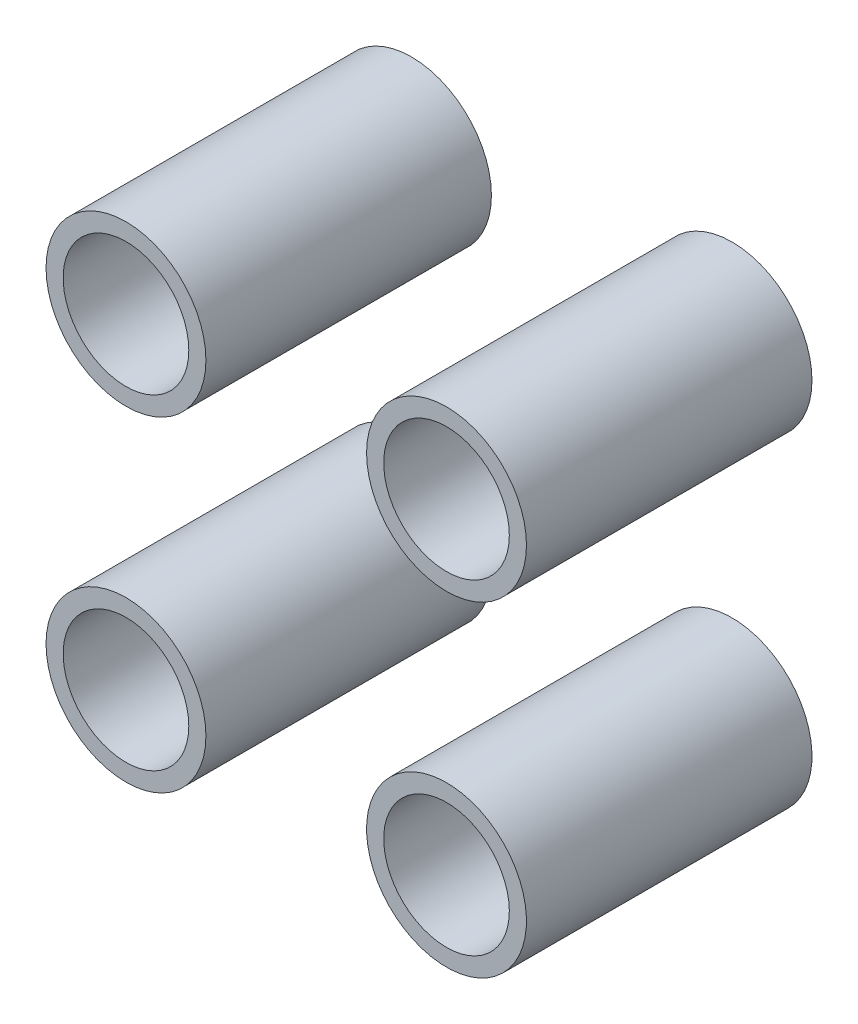
ISO-10303-21;
HEADER;
FILE_DESCRIPTION(('STEP AP214'),'2;1');
FILE_NAME('part.step','',(''),(''),'','','');
FILE_SCHEMA(('AUTOMOTIVE_DESIGN { 1 0 10303 214 1 1 1 1 }'));
ENDSEC;
DATA;
#1=APPLICATION_CONTEXT('core data for automotive mechanical design processes');
#2=APPLICATION_PROTOCOL_DEFINITION('international standard','automotive_design',2000,#1);
#3=PRODUCT_CONTEXT('',#1,'mechanical');
#4=PRODUCT('Part','Part','',(#3));
#5=PRODUCT_RELATED_PRODUCT_CATEGORY('part','',(#4));
#6=PRODUCT_DEFINITION_FORMATION('','',#4);
#7=PRODUCT_DEFINITION_CONTEXT('part definition',#1,'design');
#8=PRODUCT_DEFINITION('design','',#6,#7);
#9=PRODUCT_DEFINITION_SHAPE('','',#8);
#10=(LENGTH_UNIT() NAMED_UNIT(*) SI_UNIT(.MILLI.,.METRE.));
#11=(NAMED_UNIT(*) PLANE_ANGLE_UNIT() SI_UNIT($,.RADIAN.));
#12=(NAMED_UNIT(*) SI_UNIT($,.STERADIAN.) SOLID_ANGLE_UNIT());
#13=UNCERTAINTY_MEASURE_WITH_UNIT(LENGTH_MEASURE(1.E-05),#10,'distance_accuracy_value','');
#14=(GEOMETRIC_REPRESENTATION_CONTEXT(3) GLOBAL_UNCERTAINTY_ASSIGNED_CONTEXT((#13)) GLOBAL_UNIT_ASSIGNED_CONTEXT((#10,
#11,#12)) REPRESENTATION_CONTEXT('',''));
#15=CARTESIAN_POINT('',(0.,0.,0.));
#16=DIRECTION('',(0.,0.,1.));
#17=DIRECTION('',(1.,0.,0.));
#18=AXIS2_PLACEMENT_3D('',#15,#16,#17);
#19=CARTESIAN_POINT('',(28.0668844013724,-28.5,11.5303963476413));
#20=DIRECTION('',(0.,0.,1.));
#21=DIRECTION('',(0.40024567660561,-0.916407877726134,0.));
#22=AXIS2_PLACEMENT_3D('',#19,#20,#21);
#23=PLANE('',#22);
#24=CARTESIAN_POINT('',(28.0668844013724,-28.5,11.5303963476413));
#25=DIRECTION('',(0.,0.,1.));
#26=DIRECTION('',(0.40024567660561,-0.916407877726134,0.));
#27=AXIS2_PLACEMENT_3D('',#24,#25,#26);
#28=CIRCLE('',#27,14.);
#29=CARTESIAN_POINT('',(22.4634449288938,-15.6702897118341,11.5303963476413));
#30=VERTEX_POINT('',#29);
#31=EDGE_CURVE('P0_E10',#30,#30,#28,.T.);
#32=ORIENTED_EDGE('',*,*,#31,.T.);
#33=EDGE_LOOP('',(#32));
#34=FACE_BOUND('',#33,.T.);
#35=CARTESIAN_POINT('',(28.0668844013724,-28.5,11.5303963476413));
#36=DIRECTION('',(0.,0.,1.));
#37=DIRECTION('',(0.40024567660561,-0.916407877726134,0.));
#38=AXIS2_PLACEMENT_3D('',#35,#36,#37);
#39=CIRCLE('',#38,11.);
#40=CARTESIAN_POINT('',(23.6641819587107,-18.4195133450125,11.5303963476413));
#41=VERTEX_POINT('',#40);
#42=EDGE_CURVE('P0_E26',#41,#41,#39,.T.);
#43=ORIENTED_EDGE('',*,*,#42,.F.);
#44=EDGE_LOOP('',(#43));
#45=FACE_BOUND('',#44,.T.);
#46=ADVANCED_FACE('P0_F15',(#34,#45),#23,.T.);
#47=CARTESIAN_POINT('',(28.0668844013724,-28.5,-38.4696036523587));
#48=DIRECTION('',(0.,0.,1.));
#49=DIRECTION('',(0.40024567660561,-0.916407877726134,0.));
#50=AXIS2_PLACEMENT_3D('',#47,#48,#49);
#51=PLANE('',#50);
#52=CARTESIAN_POINT('',(28.0668844013724,-28.5,-38.4696036523587));
#53=DIRECTION('',(0.,0.,1.));
#54=DIRECTION('',(0.40024567660561,-0.916407877726134,0.));
#55=AXIS2_PLACEMENT_3D('',#52,#53,#54);
#56=CIRCLE('',#55,14.);
#57=CARTESIAN_POINT('',(22.4634449288938,-15.6702897118341,-38.4696036523587));
#58=VERTEX_POINT('',#57);
#59=EDGE_CURVE('P0_E19',#58,#58,#56,.T.);
#60=ORIENTED_EDGE('',*,*,#59,.F.);
#61=EDGE_LOOP('',(#60));
#62=FACE_BOUND('',#61,.T.);
#63=CARTESIAN_POINT('',(28.0668844013724,-28.5,-38.4696036523587));
#64=DIRECTION('',(0.,0.,1.));
#65=DIRECTION('',(0.40024567660561,-0.916407877726134,0.));
#66=AXIS2_PLACEMENT_3D('',#63,#64,#65);
#67=CIRCLE('',#66,11.);
#68=CARTESIAN_POINT('',(23.6641819587107,-18.4195133450125,-38.4696036523587));
#69=VERTEX_POINT('',#68);
#70=EDGE_CURVE('P0_E28',#69,#69,#67,.T.);
#71=ORIENTED_EDGE('',*,*,#70,.T.);
#72=EDGE_LOOP('',(#71));
#73=FACE_BOUND('',#72,.T.);
#74=ADVANCED_FACE('P0_F38',(#62,#73),#51,.F.);
#75=CARTESIAN_POINT('',(28.0668844013724,-28.5,11.5303963476413));
#76=DIRECTION('',(0.,0.,-1.));
#77=DIRECTION('',(-0.40024567660561,0.916407877726134,0.));
#78=AXIS2_PLACEMENT_3D('',#75,#76,#77);
#79=CYLINDRICAL_SURFACE('',#78,14.);
#80=CARTESIAN_POINT('',(22.4634449288938,-15.6702897118341,11.5303963476413));
#81=CARTESIAN_POINT('',(22.4634449288938,-15.6702897118341,11.0095630143079));
#82=CARTESIAN_POINT('',(22.4634449288938,-15.6702897118341,10.4887296809746));
#83=CARTESIAN_POINT('',(22.4634449288938,-15.6702897118341,9.44706301430792));
#84=CARTESIAN_POINT('',(22.4634449288938,-15.6702897118341,8.92622968097459));
#85=CARTESIAN_POINT('',(22.4634449288938,-15.6702897118341,7.88456301430792));
#86=CARTESIAN_POINT('',(22.4634449288938,-15.6702897118341,7.36372968097459));
#87=CARTESIAN_POINT('',(22.4634449288938,-15.6702897118341,6.32206301430792));
#88=CARTESIAN_POINT('',(22.4634449288938,-15.6702897118341,5.80122968097459));
#89=CARTESIAN_POINT('',(22.4634449288938,-15.6702897118341,4.75956301430792));
#90=CARTESIAN_POINT('',(22.4634449288938,-15.6702897118341,4.23872968097459));
#91=CARTESIAN_POINT('',(22.4634449288938,-15.6702897118341,3.19706301430792));
#92=CARTESIAN_POINT('',(22.4634449288938,-15.6702897118341,2.67622968097459));
#93=CARTESIAN_POINT('',(22.4634449288938,-15.6702897118341,1.63456301430792));
#94=CARTESIAN_POINT('',(22.4634449288938,-15.6702897118341,1.11372968097459));
#95=CARTESIAN_POINT('',(22.4634449288938,-15.6702897118341,0.0720630143079202));
#96=CARTESIAN_POINT('',(22.4634449288938,-15.6702897118341,-0.448770319025413));
#97=CARTESIAN_POINT('',(22.4634449288938,-15.6702897118341,-1.49043698569208));
#98=CARTESIAN_POINT('',(22.4634449288938,-15.6702897118341,-2.01127031902541));
#99=CARTESIAN_POINT('',(22.4634449288938,-15.6702897118341,-3.05293698569208));
#100=CARTESIAN_POINT('',(22.4634449288938,-15.6702897118341,-3.57377031902541));
#101=CARTESIAN_POINT('',(22.4634449288938,-15.6702897118341,-4.61543698569208));
#102=CARTESIAN_POINT('',(22.4634449288938,-15.6702897118341,-5.13627031902541));
#103=CARTESIAN_POINT('',(22.4634449288938,-15.6702897118341,-6.17793698569208));
#104=CARTESIAN_POINT('',(22.4634449288938,-15.6702897118341,-6.69877031902541));
#105=CARTESIAN_POINT('',(22.4634449288938,-15.6702897118341,-7.74043698569208));
#106=CARTESIAN_POINT('',(22.4634449288938,-15.6702897118341,-8.26127031902541));
#107=CARTESIAN_POINT('',(22.4634449288938,-15.6702897118341,-9.30293698569208));
#108=CARTESIAN_POINT('',(22.4634449288938,-15.6702897118341,-9.82377031902541));
#109=CARTESIAN_POINT('',(22.4634449288938,-15.6702897118341,-10.8654369856921));
#110=CARTESIAN_POINT('',(22.4634449288938,-15.6702897118341,-11.3862703190254));
#111=CARTESIAN_POINT('',(22.4634449288938,-15.6702897118341,-12.4279369856921));
#112=CARTESIAN_POINT('',(22.4634449288938,-15.6702897118341,-12.9487703190254));
#113=CARTESIAN_POINT('',(22.4634449288938,-15.6702897118341,-13.9904369856921));
#114=CARTESIAN_POINT('',(22.4634449288938,-15.6702897118341,-14.5112703190254));
#115=CARTESIAN_POINT('',(22.4634449288938,-15.6702897118341,-15.5529369856921));
#116=CARTESIAN_POINT('',(22.4634449288938,-15.6702897118341,-16.0737703190254));
#117=CARTESIAN_POINT('',(22.4634449288938,-15.6702897118341,-17.1154369856921));
#118=CARTESIAN_POINT('',(22.4634449288938,-15.6702897118341,-17.6362703190254));
#119=CARTESIAN_POINT('',(22.4634449288938,-15.6702897118341,-18.6779369856921));
#120=CARTESIAN_POINT('',(22.4634449288938,-15.6702897118341,-19.1987703190254));
#121=CARTESIAN_POINT('',(22.4634449288938,-15.6702897118341,-20.2404369856921));
#122=CARTESIAN_POINT('',(22.4634449288938,-15.6702897118341,-20.7612703190254));
#123=CARTESIAN_POINT('',(22.4634449288938,-15.6702897118341,-21.8029369856921));
#124=CARTESIAN_POINT('',(22.4634449288938,-15.6702897118341,-22.3237703190254));
#125=CARTESIAN_POINT('',(22.4634449288938,-15.6702897118341,-23.3654369856921));
#126=CARTESIAN_POINT('',(22.4634449288938,-15.6702897118341,-23.8862703190254));
#127=CARTESIAN_POINT('',(22.4634449288938,-15.6702897118341,-24.9279369856921));
#128=CARTESIAN_POINT('',(22.4634449288938,-15.6702897118341,-25.4487703190254));
#129=CARTESIAN_POINT('',(22.4634449288938,-15.6702897118341,-26.4904369856921));
#130=CARTESIAN_POINT('',(22.4634449288938,-15.6702897118341,-27.0112703190254));
#131=CARTESIAN_POINT('',(22.4634449288938,-15.6702897118341,-28.0529369856921));
#132=CARTESIAN_POINT('',(22.4634449288938,-15.6702897118341,-28.5737703190254));
#133=CARTESIAN_POINT('',(22.4634449288938,-15.6702897118341,-29.6154369856921));
#134=CARTESIAN_POINT('',(22.4634449288938,-15.6702897118341,-30.1362703190254));
#135=CARTESIAN_POINT('',(22.4634449288938,-15.6702897118341,-31.1779369856921));
#136=CARTESIAN_POINT('',(22.4634449288938,-15.6702897118341,-31.6987703190254));
#137=CARTESIAN_POINT('',(22.4634449288938,-15.6702897118341,-32.7404369856921));
#138=CARTESIAN_POINT('',(22.4634449288938,-15.6702897118341,-33.2612703190254));
#139=CARTESIAN_POINT('',(22.4634449288938,-15.6702897118341,-34.3029369856921));
#140=CARTESIAN_POINT('',(22.4634449288938,-15.6702897118341,-34.8237703190254));
#141=CARTESIAN_POINT('',(22.4634449288938,-15.6702897118341,-35.8654369856921));
#142=CARTESIAN_POINT('',(22.4634449288938,-15.6702897118341,-36.3862703190254));
#143=CARTESIAN_POINT('',(22.4634449288938,-15.6702897118341,-37.4279369856921));
#144=CARTESIAN_POINT('',(22.4634449288938,-15.6702897118341,-37.9487703190254));
#145=CARTESIAN_POINT('',(22.4634449288938,-15.6702897118341,-38.4696036523587));
#146=B_SPLINE_CURVE_WITH_KNOTS('',3,(#80,#81,#82,#83,#84,#85,#86,#87,#88,#89,#90,#91,#92,#93,
#94,#95,#96,#97,#98,#99,#100,#101,#102,#103,#104,#105,#106,#107,#108,#109,#110,#111,#112,#113,
#114,#115,#116,#117,#118,#119,#120,#121,#122,#123,#124,#125,#126,#127,#128,#129,#130,#131,#132,
#133,#134,#135,#136,#137,#138,#139,#140,#141,#142,#143,#144,#145),.UNSPECIFIED.,.F.,.F.,(4,2,2,
2,2,2,2,2,2,2,2,2,2,2,2,2,2,2,2,2,2,2,2,2,2,2,2,2,2,2,2,2,4),(0.,1.5625,3.125,4.6875,6.25,
7.8125,9.375,10.9375,12.5,14.0625,15.625,17.1875,18.75,20.3125,21.875,23.4375,25.,26.5625,
28.125,29.6875,31.25,32.8125,34.375,35.9375,37.5,39.0625,40.625,42.1875,43.75,45.3125,46.875,
48.4375,50.),.UNSPECIFIED.);
#147=EDGE_CURVE('P0_BSEAM17',#30,#58,#146,.T.);
#148=ORIENTED_EDGE('',*,*,#31,.F.);
#149=ORIENTED_EDGE('',*,*,#59,.T.);
#150=ORIENTED_EDGE('',*,*,#147,.T.);
#151=ORIENTED_EDGE('',*,*,#147,.F.);
#152=EDGE_LOOP('',(#148,#150,#149,#151));
#153=FACE_BOUND('',#152,.T.);
#154=ADVANCED_FACE('P0_F17',(#153),#79,.T.);
#155=CARTESIAN_POINT('',(28.0668844013724,-28.5,11.5303963476413));
#156=DIRECTION('',(0.,0.,-1.));
#157=DIRECTION('',(-0.40024567660561,0.916407877726134,0.));
#158=AXIS2_PLACEMENT_3D('',#155,#156,#157);
#159=CYLINDRICAL_SURFACE('',#158,11.);
#160=CARTESIAN_POINT('',(23.6641819587107,-18.4195133450125,11.5303963476413));
#161=CARTESIAN_POINT('',(23.6641819587107,-18.4195133450125,11.0095630143079));
#162=CARTESIAN_POINT('',(23.6641819587107,-18.4195133450125,10.4887296809746));
#163=CARTESIAN_POINT('',(23.6641819587107,-18.4195133450125,9.44706301430792));
#164=CARTESIAN_POINT('',(23.6641819587107,-18.4195133450125,8.92622968097459));
#165=CARTESIAN_POINT('',(23.6641819587107,-18.4195133450125,7.88456301430792));
#166=CARTESIAN_POINT('',(23.6641819587107,-18.4195133450125,7.36372968097459));
#167=CARTESIAN_POINT('',(23.6641819587107,-18.4195133450125,6.32206301430792));
#168=CARTESIAN_POINT('',(23.6641819587107,-18.4195133450125,5.80122968097459));
#169=CARTESIAN_POINT('',(23.6641819587107,-18.4195133450125,4.75956301430792));
#170=CARTESIAN_POINT('',(23.6641819587107,-18.4195133450125,4.23872968097459));
#171=CARTESIAN_POINT('',(23.6641819587107,-18.4195133450125,3.19706301430792));
#172=CARTESIAN_POINT('',(23.6641819587107,-18.4195133450125,2.67622968097459));
#173=CARTESIAN_POINT('',(23.6641819587107,-18.4195133450125,1.63456301430792));
#174=CARTESIAN_POINT('',(23.6641819587107,-18.4195133450125,1.11372968097459));
#175=CARTESIAN_POINT('',(23.6641819587107,-18.4195133450125,0.0720630143079202));
#176=CARTESIAN_POINT('',(23.6641819587107,-18.4195133450125,-0.448770319025413));
#177=CARTESIAN_POINT('',(23.6641819587107,-18.4195133450125,-1.49043698569208));
#178=CARTESIAN_POINT('',(23.6641819587107,-18.4195133450125,-2.01127031902541));
#179=CARTESIAN_POINT('',(23.6641819587107,-18.4195133450125,-3.05293698569208));
#180=CARTESIAN_POINT('',(23.6641819587107,-18.4195133450125,-3.57377031902541));
#181=CARTESIAN_POINT('',(23.6641819587107,-18.4195133450125,-4.61543698569208));
#182=CARTESIAN_POINT('',(23.6641819587107,-18.4195133450125,-5.13627031902541));
#183=CARTESIAN_POINT('',(23.6641819587107,-18.4195133450125,-6.17793698569208));
#184=CARTESIAN_POINT('',(23.6641819587107,-18.4195133450125,-6.69877031902541));
#185=CARTESIAN_POINT('',(23.6641819587107,-18.4195133450125,-7.74043698569208));
#186=CARTESIAN_POINT('',(23.6641819587107,-18.4195133450125,-8.26127031902541));
#187=CARTESIAN_POINT('',(23.6641819587107,-18.4195133450125,-9.30293698569208));
#188=CARTESIAN_POINT('',(23.6641819587107,-18.4195133450125,-9.82377031902541));
#189=CARTESIAN_POINT('',(23.6641819587107,-18.4195133450125,-10.8654369856921));
#190=CARTESIAN_POINT('',(23.6641819587107,-18.4195133450125,-11.3862703190254));
#191=CARTESIAN_POINT('',(23.6641819587107,-18.4195133450125,-12.4279369856921));
#192=CARTESIAN_POINT('',(23.6641819587107,-18.4195133450125,-12.9487703190254));
#193=CARTESIAN_POINT('',(23.6641819587107,-18.4195133450125,-13.9904369856921));
#194=CARTESIAN_POINT('',(23.6641819587107,-18.4195133450125,-14.5112703190254));
#195=CARTESIAN_POINT('',(23.6641819587107,-18.4195133450125,-15.5529369856921));
#196=CARTESIAN_POINT('',(23.6641819587107,-18.4195133450125,-16.0737703190254));
#197=CARTESIAN_POINT('',(23.6641819587107,-18.4195133450125,-17.1154369856921));
#198=CARTESIAN_POINT('',(23.6641819587107,-18.4195133450125,-17.6362703190254));
#199=CARTESIAN_POINT('',(23.6641819587107,-18.4195133450125,-18.6779369856921));
#200=CARTESIAN_POINT('',(23.6641819587107,-18.4195133450125,-19.1987703190254));
#201=CARTESIAN_POINT('',(23.6641819587107,-18.4195133450125,-20.2404369856921));
#202=CARTESIAN_POINT('',(23.6641819587107,-18.4195133450125,-20.7612703190254));
#203=CARTESIAN_POINT('',(23.6641819587107,-18.4195133450125,-21.8029369856921));
#204=CARTESIAN_POINT('',(23.6641819587107,-18.4195133450125,-22.3237703190254));
#205=CARTESIAN_POINT('',(23.6641819587107,-18.4195133450125,-23.3654369856921));
#206=CARTESIAN_POINT('',(23.6641819587107,-18.4195133450125,-23.8862703190254));
#207=CARTESIAN_POINT('',(23.6641819587107,-18.4195133450125,-24.9279369856921));
#208=CARTESIAN_POINT('',(23.6641819587107,-18.4195133450125,-25.4487703190254));
#209=CARTESIAN_POINT('',(23.6641819587107,-18.4195133450125,-26.4904369856921));
#210=CARTESIAN_POINT('',(23.6641819587107,-18.4195133450125,-27.0112703190254));
#211=CARTESIAN_POINT('',(23.6641819587107,-18.4195133450125,-28.0529369856921));
#212=CARTESIAN_POINT('',(23.6641819587107,-18.4195133450125,-28.5737703190254));
#213=CARTESIAN_POINT('',(23.6641819587107,-18.4195133450125,-29.6154369856921));
#214=CARTESIAN_POINT('',(23.6641819587107,-18.4195133450125,-30.1362703190254));
#215=CARTESIAN_POINT('',(23.6641819587107,-18.4195133450125,-31.1779369856921));
#216=CARTESIAN_POINT('',(23.6641819587107,-18.4195133450125,-31.6987703190254));
#217=CARTESIAN_POINT('',(23.6641819587107,-18.4195133450125,-32.7404369856921));
#218=CARTESIAN_POINT('',(23.6641819587107,-18.4195133450125,-33.2612703190254));
#219=CARTESIAN_POINT('',(23.6641819587107,-18.4195133450125,-34.3029369856921));
#220=CARTESIAN_POINT('',(23.6641819587107,-18.4195133450125,-34.8237703190254));
#221=CARTESIAN_POINT('',(23.6641819587107,-18.4195133450125,-35.8654369856921));
#222=CARTESIAN_POINT('',(23.6641819587107,-18.4195133450125,-36.3862703190254));
#223=CARTESIAN_POINT('',(23.6641819587107,-18.4195133450125,-37.4279369856921));
#224=CARTESIAN_POINT('',(23.6641819587107,-18.4195133450125,-37.9487703190254));
#225=CARTESIAN_POINT('',(23.6641819587107,-18.4195133450125,-38.4696036523587));
#226=B_SPLINE_CURVE_WITH_KNOTS('',3,(#160,#161,#162,#163,#164,#165,#166,#167,#168,#169,#170,
#171,#172,#173,#174,#175,#176,#177,#178,#179,#180,#181,#182,#183,#184,#185,#186,#187,#188,#189,
#190,#191,#192,#193,#194,#195,#196,#197,#198,#199,#200,#201,#202,#203,#204,#205,#206,#207,#208,
#209,#210,#211,#212,#213,#214,#215,#216,#217,#218,#219,#220,#221,#222,#223,#224,#225),
.UNSPECIFIED.,.F.,.F.,(4,2,2,2,2,2,2,2,2,2,2,2,2,2,2,2,2,2,2,2,2,2,2,2,2,2,2,2,2,2,2,2,4),(0.,
1.5625,3.125,4.6875,6.25,7.8125,9.375,10.9375,12.5,14.0625,15.625,17.1875,18.75,20.3125,21.875,
23.4375,25.,26.5625,28.125,29.6875,31.25,32.8125,34.375,35.9375,37.5,39.0625,40.625,42.1875,
43.75,45.3125,46.875,48.4375,50.),.UNSPECIFIED.);
#227=EDGE_CURVE('P0_BSEAM34',#41,#69,#226,.T.);
#228=ORIENTED_EDGE('',*,*,#42,.T.);
#229=ORIENTED_EDGE('',*,*,#70,.F.);
#230=ORIENTED_EDGE('',*,*,#227,.T.);
#231=ORIENTED_EDGE('',*,*,#227,.F.);
#232=EDGE_LOOP('',(#228,#230,#229,#231));
#233=FACE_BOUND('',#232,.T.);
#234=ADVANCED_FACE('P0_F34',(#233),#159,.F.);
#235=CLOSED_SHELL('',(#46,#74,#154,#234));
#236=MANIFOLD_SOLID_BREP('P0_B1',#235);
#237=CARTESIAN_POINT('',(-28.0668844013724,-28.5,11.5303963476413));
#238=DIRECTION('',(0.,0.,1.));
#239=DIRECTION('',(1.,0.,0.));
#240=AXIS2_PLACEMENT_3D('',#237,#238,#239);
#241=PLANE('',#240);
#242=CARTESIAN_POINT('',(-28.0668844013724,-28.5,11.5303963476413));
#243=DIRECTION('',(0.,0.,1.));
#244=DIRECTION('',(1.,0.,0.));
#245=AXIS2_PLACEMENT_3D('',#242,#243,#244);
#246=CIRCLE('',#245,14.);
#247=CARTESIAN_POINT('',(-14.0668844013724,-28.5,11.5303963476413));
#248=VERTEX_POINT('',#247);
#249=EDGE_CURVE('P1_E9',#248,#248,#246,.T.);
#250=ORIENTED_EDGE('',*,*,#249,.T.);
#251=EDGE_LOOP('',(#250));
#252=FACE_BOUND('',#251,.T.);
#253=CARTESIAN_POINT('',(-28.0668844013724,-28.5,11.5303963476413));
#254=DIRECTION('',(0.,0.,1.));
#255=DIRECTION('',(1.,0.,0.));
#256=AXIS2_PLACEMENT_3D('',#253,#254,#255);
#257=CIRCLE('',#256,11.);
#258=CARTESIAN_POINT('',(-17.0668844013724,-28.5,11.5303963476413));
#259=VERTEX_POINT('',#258);
#260=EDGE_CURVE('P1_E25',#259,#259,#257,.T.);
#261=ORIENTED_EDGE('',*,*,#260,.F.);
#262=EDGE_LOOP('',(#261));
#263=FACE_BOUND('',#262,.T.);
#264=ADVANCED_FACE('P1_F14',(#252,#263),#241,.T.);
#265=CARTESIAN_POINT('',(-28.0668844013724,-28.5,-38.4696036523587));
#266=DIRECTION('',(0.,0.,1.));
#267=DIRECTION('',(1.,0.,0.));
#268=AXIS2_PLACEMENT_3D('',#265,#266,#267);
#269=PLANE('',#268);
#270=CARTESIAN_POINT('',(-28.0668844013724,-28.5,-38.4696036523587));
#271=DIRECTION('',(0.,0.,1.));
#272=DIRECTION('',(1.,0.,0.));
#273=AXIS2_PLACEMENT_3D('',#270,#271,#272);
#274=CIRCLE('',#273,14.);
#275=CARTESIAN_POINT('',(-14.0668844013724,-28.5,-38.4696036523587));
#276=VERTEX_POINT('',#275);
#277=EDGE_CURVE('P1_E18',#276,#276,#274,.T.);
#278=ORIENTED_EDGE('',*,*,#277,.F.);
#279=EDGE_LOOP('',(#278));
#280=FACE_BOUND('',#279,.T.);
#281=CARTESIAN_POINT('',(-28.0668844013724,-28.5,-38.4696036523587));
#282=DIRECTION('',(0.,0.,1.));
#283=DIRECTION('',(1.,0.,0.));
#284=AXIS2_PLACEMENT_3D('',#281,#282,#283);
#285=CIRCLE('',#284,11.);
#286=CARTESIAN_POINT('',(-17.0668844013724,-28.5,-38.4696036523587));
#287=VERTEX_POINT('',#286);
#288=EDGE_CURVE('P1_E27',#287,#287,#285,.T.);
#289=ORIENTED_EDGE('',*,*,#288,.T.);
#290=EDGE_LOOP('',(#289));
#291=FACE_BOUND('',#290,.T.);
#292=ADVANCED_FACE('P1_F37',(#280,#291),#269,.F.);
#293=CARTESIAN_POINT('',(-28.0668844013724,-28.5,11.5303963476413));
#294=DIRECTION('',(0.,0.,-1.));
#295=DIRECTION('',(-1.,0.,0.));
#296=AXIS2_PLACEMENT_3D('',#293,#294,#295);
#297=CYLINDRICAL_SURFACE('',#296,14.);
#298=ORIENTED_EDGE('',*,*,#249,.F.);
#299=EDGE_LOOP('',(#298));
#300=FACE_BOUND('',#299,.T.);
#301=ORIENTED_EDGE('',*,*,#277,.T.);
#302=EDGE_LOOP('',(#301));
#303=FACE_BOUND('',#302,.T.);
#304=ADVANCED_FACE('P1_F16',(#300,#303),#297,.T.);
#305=CARTESIAN_POINT('',(-28.0668844013724,-28.5,11.5303963476413));
#306=DIRECTION('',(0.,0.,-1.));
#307=DIRECTION('',(-1.,0.,0.));
#308=AXIS2_PLACEMENT_3D('',#305,#306,#307);
#309=CYLINDRICAL_SURFACE('',#308,11.);
#310=ORIENTED_EDGE('',*,*,#260,.T.);
#311=EDGE_LOOP('',(#310));
#312=FACE_BOUND('',#311,.T.);
#313=ORIENTED_EDGE('',*,*,#288,.F.);
#314=EDGE_LOOP('',(#313));
#315=FACE_BOUND('',#314,.T.);
#316=ADVANCED_FACE('P1_F33',(#312,#315),#309,.F.);
#317=CLOSED_SHELL('',(#264,#292,#304,#316));
#318=MANIFOLD_SOLID_BREP('P1_B1',#317);
#319=CARTESIAN_POINT('',(28.0668844013724,28.5,11.5303963476413));
#320=DIRECTION('',(0.,0.,1.));
#321=DIRECTION('',(1.,0.,0.));
#322=AXIS2_PLACEMENT_3D('',#319,#320,#321);
#323=PLANE('',#322);
#324=CARTESIAN_POINT('',(28.0668844013724,28.5,11.5303963476413));
#325=DIRECTION('',(0.,0.,1.));
#326=DIRECTION('',(1.,0.,0.));
#327=AXIS2_PLACEMENT_3D('',#324,#325,#326);
#328=CIRCLE('',#327,14.);
#329=CARTESIAN_POINT('',(42.0668844013724,28.5,11.5303963476413));
#330=VERTEX_POINT('',#329);
#331=EDGE_CURVE('P2_E10',#330,#330,#328,.T.);
#332=ORIENTED_EDGE('',*,*,#331,.T.);
#333=EDGE_LOOP('',(#332));
#334=FACE_BOUND('',#333,.T.);
#335=CARTESIAN_POINT('',(28.0668844013724,28.5,11.5303963476413));
#336=DIRECTION('',(0.,0.,1.));
#337=DIRECTION('',(1.,0.,0.));
#338=AXIS2_PLACEMENT_3D('',#335,#336,#337);
#339=CIRCLE('',#338,11.);
#340=CARTESIAN_POINT('',(39.0668844013724,28.5,11.5303963476413));
#341=VERTEX_POINT('',#340);
#342=EDGE_CURVE('P2_E26',#341,#341,#339,.T.);
#343=ORIENTED_EDGE('',*,*,#342,.F.);
#344=EDGE_LOOP('',(#343));
#345=FACE_BOUND('',#344,.T.);
#346=ADVANCED_FACE('P2_F15',(#334,#345),#323,.T.);
#347=CARTESIAN_POINT('',(28.0668844013724,28.5,-38.4696036523587));
#348=DIRECTION('',(0.,0.,1.));
#349=DIRECTION('',(1.,0.,0.));
#350=AXIS2_PLACEMENT_3D('',#347,#348,#349);
#351=PLANE('',#350);
#352=CARTESIAN_POINT('',(28.0668844013724,28.5,-38.4696036523587));
#353=DIRECTION('',(0.,0.,1.));
#354=DIRECTION('',(1.,0.,0.));
#355=AXIS2_PLACEMENT_3D('',#352,#353,#354);
#356=CIRCLE('',#355,14.);
#357=CARTESIAN_POINT('',(42.0668844013724,28.5,-38.4696036523587));
#358=VERTEX_POINT('',#357);
#359=EDGE_CURVE('P2_E19',#358,#358,#356,.T.);
#360=ORIENTED_EDGE('',*,*,#359,.F.);
#361=EDGE_LOOP('',(#360));
#362=FACE_BOUND('',#361,.T.);
#363=CARTESIAN_POINT('',(28.0668844013724,28.5,-38.4696036523587));
#364=DIRECTION('',(0.,0.,1.));
#365=DIRECTION('',(1.,0.,0.));
#366=AXIS2_PLACEMENT_3D('',#363,#364,#365);
#367=CIRCLE('',#366,11.);
#368=CARTESIAN_POINT('',(39.0668844013724,28.5,-38.4696036523587));
#369=VERTEX_POINT('',#368);
#370=EDGE_CURVE('P2_E28',#369,#369,#367,.T.);
#371=ORIENTED_EDGE('',*,*,#370,.T.);
#372=EDGE_LOOP('',(#371));
#373=FACE_BOUND('',#372,.T.);
#374=ADVANCED_FACE('P2_F38',(#362,#373),#351,.F.);
#375=CARTESIAN_POINT('',(28.0668844013724,28.5,11.5303963476413));
#376=DIRECTION('',(0.,0.,-1.));
#377=DIRECTION('',(-1.,0.,0.));
#378=AXIS2_PLACEMENT_3D('',#375,#376,#377);
#379=CYLINDRICAL_SURFACE('',#378,14.);
#380=ORIENTED_EDGE('',*,*,#331,.F.);
#381=EDGE_LOOP('',(#380));
#382=FACE_BOUND('',#381,.T.);
#383=ORIENTED_EDGE('',*,*,#359,.T.);
#384=EDGE_LOOP('',(#383));
#385=FACE_BOUND('',#384,.T.);
#386=ADVANCED_FACE('P2_F17',(#382,#385),#379,.T.);
#387=CARTESIAN_POINT('',(28.0668844013724,28.5,11.5303963476413));
#388=DIRECTION('',(0.,0.,-1.));
#389=DIRECTION('',(-1.,0.,0.));
#390=AXIS2_PLACEMENT_3D('',#387,#388,#389);
#391=CYLINDRICAL_SURFACE('',#390,11.);
#392=ORIENTED_EDGE('',*,*,#342,.T.);
#393=EDGE_LOOP('',(#392));
#394=FACE_BOUND('',#393,.T.);
#395=ORIENTED_EDGE('',*,*,#370,.F.);
#396=EDGE_LOOP('',(#395));
#397=FACE_BOUND('',#396,.T.);
#398=ADVANCED_FACE('P2_F34',(#394,#397),#391,.F.);
#399=CLOSED_SHELL('',(#346,#374,#386,#398));
#400=MANIFOLD_SOLID_BREP('P2_B1',#399);
#401=CARTESIAN_POINT('',(-28.0668844013724,28.5,11.5303963476413));
#402=DIRECTION('',(0.,0.,1.));
#403=DIRECTION('',(1.,0.,0.));
#404=AXIS2_PLACEMENT_3D('',#401,#402,#403);
#405=PLANE('',#404);
#406=CARTESIAN_POINT('',(-28.0668844013724,28.5,11.5303963476413));
#407=DIRECTION('',(0.,0.,1.));
#408=DIRECTION('',(1.,0.,0.));
#409=AXIS2_PLACEMENT_3D('',#406,#407,#408);
#410=CIRCLE('',#409,14.);
#411=CARTESIAN_POINT('',(-14.0668844013724,28.5,11.5303963476413));
#412=VERTEX_POINT('',#411);
#413=EDGE_CURVE('P3_E10',#412,#412,#410,.T.);
#414=ORIENTED_EDGE('',*,*,#413,.T.);
#415=EDGE_LOOP('',(#414));
#416=FACE_BOUND('',#415,.T.);
#417=CARTESIAN_POINT('',(-28.0668844013724,28.5,11.5303963476413));
#418=DIRECTION('',(0.,0.,1.));
#419=DIRECTION('',(1.,0.,0.));
#420=AXIS2_PLACEMENT_3D('',#417,#418,#419);
#421=CIRCLE('',#420,11.);
#422=CARTESIAN_POINT('',(-17.0668844013724,28.5,11.5303963476413));
#423=VERTEX_POINT('',#422);
#424=EDGE_CURVE('P3_E26',#423,#423,#421,.T.);
#425=ORIENTED_EDGE('',*,*,#424,.F.);
#426=EDGE_LOOP('',(#425));
#427=FACE_BOUND('',#426,.T.);
#428=ADVANCED_FACE('P3_F15',(#416,#427),#405,.T.);
#429=CARTESIAN_POINT('',(-28.0668844013724,28.5,-38.4696036523587));
#430=DIRECTION('',(0.,0.,1.));
#431=DIRECTION('',(1.,0.,0.));
#432=AXIS2_PLACEMENT_3D('',#429,#430,#431);
#433=PLANE('',#432);
#434=CARTESIAN_POINT('',(-28.0668844013724,28.5,-38.4696036523587));
#435=DIRECTION('',(0.,0.,1.));
#436=DIRECTION('',(1.,0.,0.));
#437=AXIS2_PLACEMENT_3D('',#434,#435,#436);
#438=CIRCLE('',#437,14.);
#439=CARTESIAN_POINT('',(-14.0668844013724,28.5,-38.4696036523587));
#440=VERTEX_POINT('',#439);
#441=EDGE_CURVE('P3_E19',#440,#440,#438,.T.);
#442=ORIENTED_EDGE('',*,*,#441,.F.);
#443=EDGE_LOOP('',(#442));
#444=FACE_BOUND('',#443,.T.);
#445=CARTESIAN_POINT('',(-28.0668844013724,28.5,-38.4696036523587));
#446=DIRECTION('',(0.,0.,1.));
#447=DIRECTION('',(1.,0.,0.));
#448=AXIS2_PLACEMENT_3D('',#445,#446,#447);
#449=CIRCLE('',#448,11.);
#450=CARTESIAN_POINT('',(-17.0668844013724,28.5,-38.4696036523587));
#451=VERTEX_POINT('',#450);
#452=EDGE_CURVE('P3_E28',#451,#451,#449,.T.);
#453=ORIENTED_EDGE('',*,*,#452,.T.);
#454=EDGE_LOOP('',(#453));
#455=FACE_BOUND('',#454,.T.);
#456=ADVANCED_FACE('P3_F38',(#444,#455),#433,.F.);
#457=CARTESIAN_POINT('',(-28.0668844013724,28.5,11.5303963476413));
#458=DIRECTION('',(0.,0.,-1.));
#459=DIRECTION('',(-1.,0.,0.));
#460=AXIS2_PLACEMENT_3D('',#457,#458,#459);
#461=CYLINDRICAL_SURFACE('',#460,14.);
#462=ORIENTED_EDGE('',*,*,#413,.F.);
#463=EDGE_LOOP('',(#462));
#464=FACE_BOUND('',#463,.T.);
#465=ORIENTED_EDGE('',*,*,#441,.T.);
#466=EDGE_LOOP('',(#465));
#467=FACE_BOUND('',#466,.T.);
#468=ADVANCED_FACE('P3_F17',(#464,#467),#461,.T.);
#469=CARTESIAN_POINT('',(-28.0668844013724,28.5,11.5303963476413));
#470=DIRECTION('',(0.,0.,-1.));
#471=DIRECTION('',(-1.,0.,0.));
#472=AXIS2_PLACEMENT_3D('',#469,#470,#471);
#473=CYLINDRICAL_SURFACE('',#472,11.);
#474=ORIENTED_EDGE('',*,*,#424,.T.);
#475=EDGE_LOOP('',(#474));
#476=FACE_BOUND('',#475,.T.);
#477=ORIENTED_EDGE('',*,*,#452,.F.);
#478=EDGE_LOOP('',(#477));
#479=FACE_BOUND('',#478,.T.);
#480=ADVANCED_FACE('P3_F34',(#476,#479),#473,.F.);
#481=CLOSED_SHELL('',(#428,#456,#468,#480));
#482=MANIFOLD_SOLID_BREP('P3_B1',#481);
#483=ADVANCED_BREP_SHAPE_REPRESENTATION('',(#18,#236,#318,#400,#482),#14);
#484=SHAPE_DEFINITION_REPRESENTATION(#9,#483);
ENDSEC;
END-ISO-10303-21;
